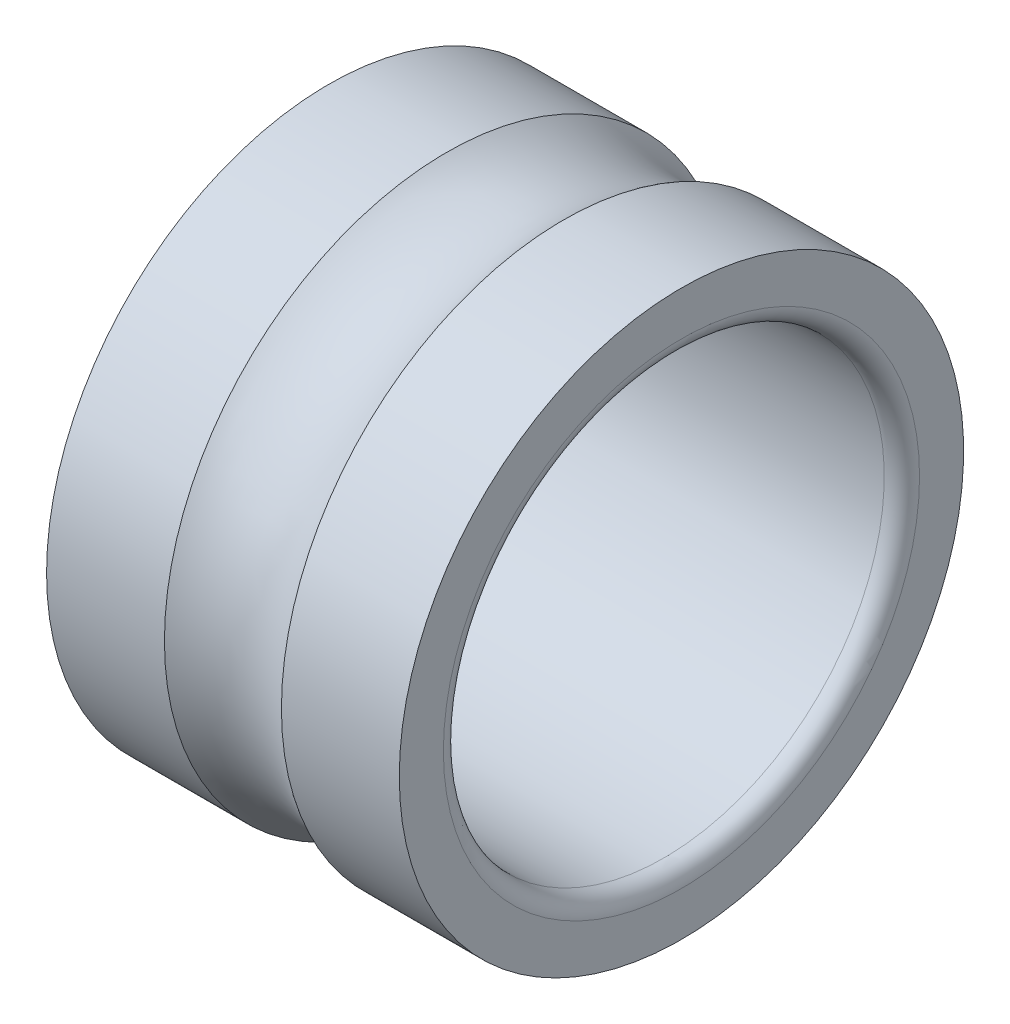
ISO-10303-21;
HEADER;
FILE_DESCRIPTION(('STEP AP214'),'2;1');
FILE_NAME('part.step','',(''),(''),'','','');
FILE_SCHEMA(('AUTOMOTIVE_DESIGN { 1 0 10303 214 1 1 1 1 }'));
ENDSEC;
DATA;
#1=APPLICATION_CONTEXT('core data for automotive mechanical design processes');
#2=APPLICATION_PROTOCOL_DEFINITION('international standard','automotive_design',2000,#1);
#3=PRODUCT_CONTEXT('',#1,'mechanical');
#4=PRODUCT('Part','Part','',(#3));
#5=PRODUCT_RELATED_PRODUCT_CATEGORY('part','',(#4));
#6=PRODUCT_DEFINITION_FORMATION('','',#4);
#7=PRODUCT_DEFINITION_CONTEXT('part definition',#1,'design');
#8=PRODUCT_DEFINITION('design','',#6,#7);
#9=PRODUCT_DEFINITION_SHAPE('','',#8);
#10=(LENGTH_UNIT() NAMED_UNIT(*) SI_UNIT(.MILLI.,.METRE.));
#11=(NAMED_UNIT(*) PLANE_ANGLE_UNIT() SI_UNIT($,.RADIAN.));
#12=(NAMED_UNIT(*) SI_UNIT($,.STERADIAN.) SOLID_ANGLE_UNIT());
#13=UNCERTAINTY_MEASURE_WITH_UNIT(LENGTH_MEASURE(1.E-05),#10,'distance_accuracy_value','');
#14=(GEOMETRIC_REPRESENTATION_CONTEXT(3) GLOBAL_UNCERTAINTY_ASSIGNED_CONTEXT((#13)) GLOBAL_UNIT_ASSIGNED_CONTEXT((#10,
#11,#12)) REPRESENTATION_CONTEXT('',''));
#15=CARTESIAN_POINT('',(0.,0.,0.));
#16=DIRECTION('',(0.,0.,1.));
#17=DIRECTION('',(1.,0.,0.));
#18=AXIS2_PLACEMENT_3D('',#15,#16,#17);
#19=CARTESIAN_POINT('',(10.,16.,0.));
#20=DIRECTION('',(-1.,0.,0.));
#21=DIRECTION('',(0.,0.,1.));
#22=AXIS2_PLACEMENT_3D('',#19,#20,#21);
#23=PLANE('',#22);
#24=CARTESIAN_POINT('',(10.,0.,0.));
#25=DIRECTION('',(-1.,0.,0.));
#26=DIRECTION('',(0.,0.,1.));
#27=AXIS2_PLACEMENT_3D('',#24,#25,#26);
#28=CIRCLE('',#27,16.);
#29=CARTESIAN_POINT('',(10.,0.,16.));
#30=VERTEX_POINT('',#29);
#31=EDGE_CURVE('E59',#30,#30,#28,.T.);
#32=ORIENTED_EDGE('',*,*,#31,.F.);
#33=EDGE_LOOP('',(#32));
#34=FACE_BOUND('',#33,.T.);
#35=CARTESIAN_POINT('',(10.,0.,0.));
#36=DIRECTION('',(-1.,0.,0.));
#37=DIRECTION('',(0.,0.,1.));
#38=AXIS2_PLACEMENT_3D('',#35,#36,#37);
#39=CIRCLE('',#38,13.5);
#40=CARTESIAN_POINT('',(10.,0.,13.5));
#41=VERTEX_POINT('',#40);
#42=EDGE_CURVE('E10',#41,#41,#39,.T.);
#43=ORIENTED_EDGE('',*,*,#42,.T.);
#44=EDGE_LOOP('',(#43));
#45=FACE_BOUND('',#44,.T.);
#46=ADVANCED_FACE('F31',(#34,#45),#23,.F.);
#47=CARTESIAN_POINT('',(9.,0.,0.));
#48=DIRECTION('',(-1.,0.,0.));
#49=DIRECTION('',(0.,0.,1.));
#50=AXIS2_PLACEMENT_3D('',#47,#48,#49);
#51=TOROIDAL_SURFACE('',#50,13.5,0.999999999999999);
#52=ORIENTED_EDGE('',*,*,#42,.F.);
#53=EDGE_LOOP('',(#52));
#54=FACE_BOUND('',#53,.T.);
#55=CARTESIAN_POINT('',(8.99999999999999,0.,0.));
#56=DIRECTION('',(-1.,0.,0.));
#57=DIRECTION('',(0.,0.,1.));
#58=AXIS2_PLACEMENT_3D('',#55,#56,#57);
#59=CIRCLE('',#58,12.5);
#60=CARTESIAN_POINT('',(8.99999999999999,0.,12.5));
#61=VERTEX_POINT('',#60);
#62=EDGE_CURVE('E37',#61,#61,#59,.T.);
#63=ORIENTED_EDGE('',*,*,#62,.T.);
#64=EDGE_LOOP('',(#63));
#65=FACE_BOUND('',#64,.T.);
#66=ADVANCED_FACE('F66',(#54,#65),#51,.T.);
#67=CARTESIAN_POINT('',(-27.7777777777778,0.,0.));
#68=DIRECTION('',(-1.,0.,0.));
#69=DIRECTION('',(0.,0.,1.));
#70=AXIS2_PLACEMENT_3D('',#67,#68,#69);
#71=CYLINDRICAL_SURFACE('',#70,12.5);
#72=ORIENTED_EDGE('',*,*,#62,.F.);
#73=EDGE_LOOP('',(#72));
#74=FACE_BOUND('',#73,.T.);
#75=CARTESIAN_POINT('',(-8.99999999999999,0.,0.));
#76=DIRECTION('',(-1.,0.,0.));
#77=DIRECTION('',(0.,0.,1.));
#78=AXIS2_PLACEMENT_3D('',#75,#76,#77);
#79=CIRCLE('',#78,12.5);
#80=CARTESIAN_POINT('',(-8.99999999999999,0.,12.5));
#81=VERTEX_POINT('',#80);
#82=EDGE_CURVE('E41',#81,#81,#79,.T.);
#83=ORIENTED_EDGE('',*,*,#82,.T.);
#84=EDGE_LOOP('',(#83));
#85=FACE_BOUND('',#84,.T.);
#86=ADVANCED_FACE('F70',(#74,#85),#71,.F.);
#87=CARTESIAN_POINT('',(-9.,0.,0.));
#88=DIRECTION('',(-1.,0.,0.));
#89=DIRECTION('',(0.,0.,1.));
#90=AXIS2_PLACEMENT_3D('',#87,#88,#89);
#91=TOROIDAL_SURFACE('',#90,13.5,1.);
#92=ORIENTED_EDGE('',*,*,#82,.F.);
#93=EDGE_LOOP('',(#92));
#94=FACE_BOUND('',#93,.T.);
#95=CARTESIAN_POINT('',(-10.,0.,0.));
#96=DIRECTION('',(-1.,0.,0.));
#97=DIRECTION('',(0.,0.,1.));
#98=AXIS2_PLACEMENT_3D('',#95,#96,#97);
#99=CIRCLE('',#98,13.5);
#100=CARTESIAN_POINT('',(-10.,0.,13.5));
#101=VERTEX_POINT('',#100);
#102=EDGE_CURVE('E45',#101,#101,#99,.T.);
#103=ORIENTED_EDGE('',*,*,#102,.T.);
#104=EDGE_LOOP('',(#103));
#105=FACE_BOUND('',#104,.T.);
#106=ADVANCED_FACE('F75',(#94,#105),#91,.T.);
#107=CARTESIAN_POINT('',(-10.,16.,0.));
#108=DIRECTION('',(1.,0.,0.));
#109=DIRECTION('',(0.,0.,-1.));
#110=AXIS2_PLACEMENT_3D('',#107,#108,#109);
#111=PLANE('',#110);
#112=ORIENTED_EDGE('',*,*,#102,.F.);
#113=EDGE_LOOP('',(#112));
#114=FACE_BOUND('',#113,.T.);
#115=CARTESIAN_POINT('',(-10.,0.,0.));
#116=DIRECTION('',(-1.,0.,0.));
#117=DIRECTION('',(0.,0.,1.));
#118=AXIS2_PLACEMENT_3D('',#115,#116,#117);
#119=CIRCLE('',#118,16.);
#120=CARTESIAN_POINT('',(-10.,0.,16.));
#121=VERTEX_POINT('',#120);
#122=EDGE_CURVE('E50',#121,#121,#119,.T.);
#123=ORIENTED_EDGE('',*,*,#122,.T.);
#124=EDGE_LOOP('',(#123));
#125=FACE_BOUND('',#124,.T.);
#126=ADVANCED_FACE('F81',(#114,#125),#111,.F.);
#127=CARTESIAN_POINT('',(-27.7777777777778,0.,0.));
#128=DIRECTION('',(-1.,0.,0.));
#129=DIRECTION('',(0.,0.,1.));
#130=AXIS2_PLACEMENT_3D('',#127,#128,#129);
#131=CYLINDRICAL_SURFACE('',#130,16.);
#132=ORIENTED_EDGE('',*,*,#122,.F.);
#133=EDGE_LOOP('',(#132));
#134=FACE_BOUND('',#133,.T.);
#135=CARTESIAN_POINT('',(-3.3166247903554,0.,0.));
#136=DIRECTION('',(-1.,0.,0.));
#137=DIRECTION('',(0.,0.,1.));
#138=AXIS2_PLACEMENT_3D('',#135,#136,#137);
#139=CIRCLE('',#138,16.);
#140=CARTESIAN_POINT('',(-3.3166247903554,0.,16.));
#141=VERTEX_POINT('',#140);
#142=EDGE_CURVE('E53',#141,#141,#139,.T.);
#143=ORIENTED_EDGE('',*,*,#142,.T.);
#144=EDGE_LOOP('',(#143));
#145=FACE_BOUND('',#144,.T.);
#146=ADVANCED_FACE('F85',(#134,#145),#131,.T.);
#147=CARTESIAN_POINT('',(0.,0.,0.));
#148=DIRECTION('',(-1.,0.,0.));
#149=DIRECTION('',(0.,0.,1.));
#150=AXIS2_PLACEMENT_3D('',#147,#148,#149);
#151=TOROIDAL_SURFACE('',#150,21.,6.);
#152=ORIENTED_EDGE('',*,*,#142,.F.);
#153=EDGE_LOOP('',(#152));
#154=FACE_BOUND('',#153,.T.);
#155=CARTESIAN_POINT('',(3.3166247903554,0.,0.));
#156=DIRECTION('',(-1.,0.,0.));
#157=DIRECTION('',(0.,0.,1.));
#158=AXIS2_PLACEMENT_3D('',#155,#156,#157);
#159=CIRCLE('',#158,16.);
#160=CARTESIAN_POINT('',(3.3166247903554,0.,16.));
#161=VERTEX_POINT('',#160);
#162=EDGE_CURVE('E56',#161,#161,#159,.T.);
#163=ORIENTED_EDGE('',*,*,#162,.T.);
#164=EDGE_LOOP('',(#163));
#165=FACE_BOUND('',#164,.T.);
#166=ADVANCED_FACE('F89',(#154,#165),#151,.F.);
#167=CARTESIAN_POINT('',(-27.7777777777778,0.,0.));
#168=DIRECTION('',(-1.,0.,0.));
#169=DIRECTION('',(0.,0.,1.));
#170=AXIS2_PLACEMENT_3D('',#167,#168,#169);
#171=CYLINDRICAL_SURFACE('',#170,16.);
#172=ORIENTED_EDGE('',*,*,#162,.F.);
#173=EDGE_LOOP('',(#172));
#174=FACE_BOUND('',#173,.T.);
#175=ORIENTED_EDGE('',*,*,#31,.T.);
#176=EDGE_LOOP('',(#175));
#177=FACE_BOUND('',#176,.T.);
#178=ADVANCED_FACE('F63',(#174,#177),#171,.T.);
#179=CLOSED_SHELL('',(#46,#66,#86,#106,#126,#146,#166,#178));
#180=MANIFOLD_SOLID_BREP('B2',#179);
#181=ADVANCED_BREP_SHAPE_REPRESENTATION('',(#18,#180),#14);
#182=SHAPE_DEFINITION_REPRESENTATION(#9,#181);
ENDSEC;
END-ISO-10303-21;
